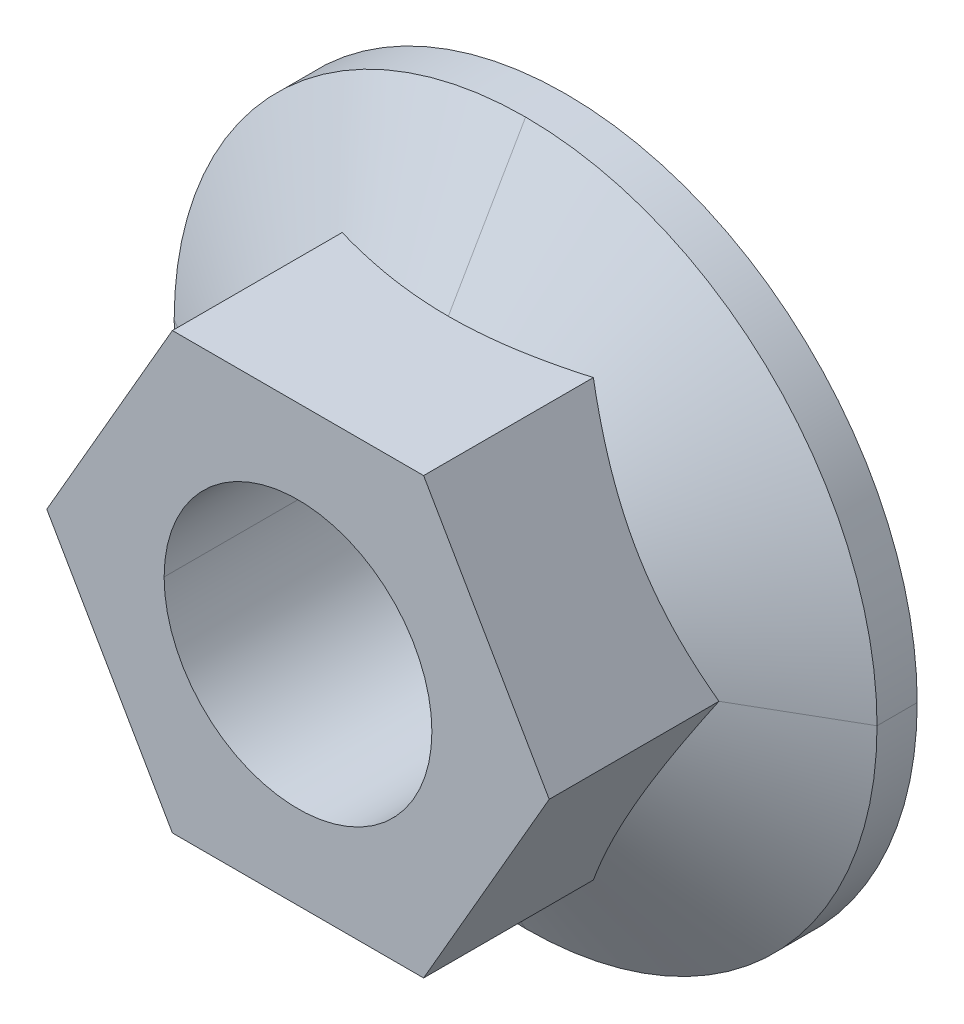
ISO-10303-21;
HEADER;
FILE_DESCRIPTION(('STEP AP214'),'2;1');
FILE_NAME('part.step','',(''),(''),'','','');
FILE_SCHEMA(('AUTOMOTIVE_DESIGN { 1 0 10303 214 1 1 1 1 }'));
ENDSEC;
DATA;
#1=APPLICATION_CONTEXT('core data for automotive mechanical design processes');
#2=APPLICATION_PROTOCOL_DEFINITION('international standard','automotive_design',2000,#1);
#3=PRODUCT_CONTEXT('',#1,'mechanical');
#4=PRODUCT('Part','Part','',(#3));
#5=PRODUCT_RELATED_PRODUCT_CATEGORY('part','',(#4));
#6=PRODUCT_DEFINITION_FORMATION('','',#4);
#7=PRODUCT_DEFINITION_CONTEXT('part definition',#1,'design');
#8=PRODUCT_DEFINITION('design','',#6,#7);
#9=PRODUCT_DEFINITION_SHAPE('','',#8);
#10=(LENGTH_UNIT() NAMED_UNIT(*) SI_UNIT(.MILLI.,.METRE.));
#11=(NAMED_UNIT(*) PLANE_ANGLE_UNIT() SI_UNIT($,.RADIAN.));
#12=(NAMED_UNIT(*) SI_UNIT($,.STERADIAN.) SOLID_ANGLE_UNIT());
#13=UNCERTAINTY_MEASURE_WITH_UNIT(LENGTH_MEASURE(1.E-05),#10,'distance_accuracy_value','');
#14=(GEOMETRIC_REPRESENTATION_CONTEXT(3) GLOBAL_UNCERTAINTY_ASSIGNED_CONTEXT((#13)) GLOBAL_UNIT_ASSIGNED_CONTEXT((#10,
#11,#12)) REPRESENTATION_CONTEXT('',''));
#15=CARTESIAN_POINT('',(0.,0.,0.));
#16=DIRECTION('',(0.,0.,1.));
#17=DIRECTION('',(1.,0.,0.));
#18=AXIS2_PLACEMENT_3D('',#15,#16,#17);
#19=CARTESIAN_POINT('',(-7.69319233695161,-0.325000000000484,8.2535577753421));
#20=DIRECTION('',(-0.866025403784461,0.499999999999961,0.));
#21=DIRECTION('',(0.,0.,1.));
#22=AXIS2_PLACEMENT_3D('',#19,#20,#21);
#23=PLANE('',#22);
#24=DIRECTION('',(0.,0.,-1.));
#25=VECTOR('',#24,1.);
#26=CARTESIAN_POINT('',(-3.75277674973342,6.49999999999976,8.));
#27=LINE('',#26,#25);
#28=CARTESIAN_POINT('',(-3.75277674973342,6.49999999999976,8.));
#29=VERTEX_POINT('',#28);
#30=CARTESIAN_POINT('',(-3.75277674973342,6.49999999999976,2.928844493158));
#31=VERTEX_POINT('',#30);
#32=EDGE_CURVE('E11',#29,#31,#27,.T.);
#33=ORIENTED_EDGE('',*,*,#32,.T.);
#34=CARTESIAN_POINT('',(-3.75277674973287,6.49999999999944,2.928844493158));
#35=CARTESIAN_POINT('',(-4.2551902713605,5.62979425413068,3.21891307511229));
#36=CARTESIAN_POINT('',(-4.70764700601063,4.84611620148987,3.3614471829164));
#37=CARTESIAN_POINT('',(-5.17712493961034,4.03295656746265,3.50934335347754));
#38=CARTESIAN_POINT('',(-5.62916551508448,3.24999932365868,3.5093859456862));
#39=CARTESIAN_POINT('',(-6.08068412274653,2.46794615462516,3.50942848871397));
#40=CARTESIAN_POINT('',(-6.55068458913403,1.65388146726086,3.36144678727725));
#41=CARTESIAN_POINT('',(-7.00284985851243,0.870708247279326,3.21908057558494));
#42=CARTESIAN_POINT('',(-7.505553499465,-4.86644145120119E-13,2.928844493158));
#43=B_SPLINE_CURVE_WITH_KNOTS('',2,(#34,#35,#36,#37,#38,#39,#40,#41,#42),.UNSPECIFIED.,.F.,.F.,
(3,2,2,2,3),(0.,0.25,0.5,0.75,1.),.UNSPECIFIED.);
#44=CARTESIAN_POINT('',(-7.505553499465,-4.88124996424892E-13,2.928844493158));
#45=VERTEX_POINT('',#44);
#46=EDGE_CURVE('E256',#31,#45,#43,.T.);
#47=ORIENTED_EDGE('',*,*,#46,.T.);
#48=DIRECTION('',(0.,0.,-1.));
#49=VECTOR('',#48,1.);
#50=CARTESIAN_POINT('',(-7.505553499465,-4.87814487950439E-13,8.));
#51=LINE('',#50,#49);
#52=CARTESIAN_POINT('',(-7.505553499465,-4.87814487950439E-13,8.));
#53=VERTEX_POINT('',#52);
#54=EDGE_CURVE('E269',#53,#45,#51,.T.);
#55=ORIENTED_EDGE('',*,*,#54,.F.);
#56=DIRECTION('',(0.499999999999887,0.866025403784504,0.));
#57=VECTOR('',#56,1.);
#58=CARTESIAN_POINT('',(-7.505553499465,-4.87814487950439E-13,8.));
#59=LINE('',#58,#57);
#60=EDGE_CURVE('E363',#53,#29,#59,.T.);
#61=ORIENTED_EDGE('',*,*,#60,.T.);
#62=EDGE_LOOP('',(#33,#47,#55,#61));
#63=FACE_BOUND('',#62,.T.);
#64=ADVANCED_FACE('F16',(#63),#23,.T.);
#65=CARTESIAN_POINT('',(-4.12805442470672,6.49999999999973,8.2535577753421));
#66=DIRECTION('',(0.,1.,0.));
#67=DIRECTION('',(1.,0.,0.));
#68=AXIS2_PLACEMENT_3D('',#65,#66,#67);
#69=PLANE('',#68);
#70=DIRECTION('',(0.,0.,-1.));
#71=VECTOR('',#70,1.);
#72=CARTESIAN_POINT('',(3.75277674973258,6.50000000000024,8.));
#73=LINE('',#72,#71);
#74=CARTESIAN_POINT('',(3.75277674973258,6.50000000000024,8.));
#75=VERTEX_POINT('',#74);
#76=CARTESIAN_POINT('',(3.75277674973258,6.50000000000024,2.928844493158));
#77=VERTEX_POINT('',#76);
#78=EDGE_CURVE('E28',#75,#77,#73,.T.);
#79=ORIENTED_EDGE('',*,*,#78,.T.);
#80=CARTESIAN_POINT('',(3.75277674973258,6.50000000000024,2.928844493158));
#81=CARTESIAN_POINT('',(2.74794927567332,6.50000000000018,3.21891319947502));
#82=CARTESIAN_POINT('',(1.84303567592422,6.50000000000012,3.36144726382099));
#83=CARTESIAN_POINT('',(0.903809546080359,6.50000000000006,3.50938593737357));
#84=CARTESIAN_POINT('',(-4.30211422042248E-13,6.5,3.50938593842317));
#85=B_SPLINE_CURVE_WITH_KNOTS('',2,(#80,#81,#82,#83,#84),.UNSPECIFIED.,.F.,.F.,(3,2,3),(0.,0.5,
1.),.UNSPECIFIED.);
#86=CARTESIAN_POINT('',(-4.13110422832091E-13,6.5,3.50940106915116));
#87=VERTEX_POINT('',#86);
#88=EDGE_CURVE('E365',#77,#87,#85,.T.);
#89=ORIENTED_EDGE('',*,*,#88,.T.);
#90=CARTESIAN_POINT('',(-4.30211422042248E-13,6.5,3.50938593842317));
#91=CARTESIAN_POINT('',(-0.903305607520865,6.49999999999994,3.50938593947218));
#92=CARTESIAN_POINT('',(-1.84303487596856,6.49999999999988,3.36144739456328));
#93=CARTESIAN_POINT('',(-2.74736684883038,6.49999999999982,3.21908133162181));
#94=CARTESIAN_POINT('',(-3.75277674973342,6.49999999999975,2.928844493158));
#95=B_SPLINE_CURVE_WITH_KNOTS('',2,(#90,#91,#92,#93,#94),.UNSPECIFIED.,.F.,.F.,(3,2,3),(0.,0.5,
1.),.UNSPECIFIED.);
#96=EDGE_CURVE('E273',#87,#31,#95,.T.);
#97=ORIENTED_EDGE('',*,*,#96,.T.);
#98=ORIENTED_EDGE('',*,*,#32,.F.);
#99=DIRECTION('',(1.,0.,0.));
#100=VECTOR('',#99,1.);
#101=CARTESIAN_POINT('',(-3.75277674973342,6.49999999999976,8.));
#102=LINE('',#101,#100);
#103=EDGE_CURVE('E601',#29,#75,#102,.T.);
#104=ORIENTED_EDGE('',*,*,#103,.T.);
#105=EDGE_LOOP('',(#79,#89,#97,#98,#104));
#106=FACE_BOUND('',#105,.T.);
#107=ADVANCED_FACE('F341',(#106),#69,.T.);
#108=CARTESIAN_POINT('',(3.56513791224593,6.82500000000022,8.2535577753421));
#109=DIRECTION('',(0.866025403784396,0.500000000000073,0.));
#110=DIRECTION('',(0.,0.,-1.));
#111=AXIS2_PLACEMENT_3D('',#108,#109,#110);
#112=PLANE('',#111);
#113=DIRECTION('',(0.,0.,-1.));
#114=VECTOR('',#113,1.);
#115=CARTESIAN_POINT('',(7.505553499465,4.88794173070438E-13,8.));
#116=LINE('',#115,#114);
#117=CARTESIAN_POINT('',(7.505553499465,4.88794173070438E-13,8.));
#118=VERTEX_POINT('',#117);
#119=CARTESIAN_POINT('',(7.505553499465,4.88483664595985E-13,2.928844493158));
#120=VERTEX_POINT('',#119);
#121=EDGE_CURVE('E292',#118,#120,#116,.T.);
#122=ORIENTED_EDGE('',*,*,#121,.T.);
#123=CARTESIAN_POINT('',(7.50555349946556,8.10115863281169E-13,2.928844493158));
#124=CARTESIAN_POINT('',(7.0031405312489,0.870204787333379,3.21891275560065));
#125=CARTESIAN_POINT('',(6.55068391641673,1.65388263244317,3.36144699833052));
#126=CARTESIAN_POINT('',(6.08120648335359,2.46704139951538,3.50934319037811));
#127=CARTESIAN_POINT('',(5.62916579924058,3.24999883148715,3.50938594638627));
#128=CARTESIAN_POINT('',(5.17764828074596,4.0320501140271,3.5094286529111));
#129=CARTESIAN_POINT('',(4.70764857465841,4.84611348451301,3.36144768267794));
#130=CARTESIAN_POINT('',(4.25548210837812,5.62928877758921,3.21908156729445));
#131=CARTESIAN_POINT('',(3.75277674973258,6.50000000000024,2.928844493158));
#132=B_SPLINE_CURVE_WITH_KNOTS('',2,(#123,#124,#125,#126,#127,#128,#129,#130,#131),
.UNSPECIFIED.,.F.,.F.,(3,2,2,2,3),(0.,0.25,0.5,0.75,1.),.UNSPECIFIED.);
#133=EDGE_CURVE('E325',#120,#77,#132,.T.);
#134=ORIENTED_EDGE('',*,*,#133,.T.);
#135=ORIENTED_EDGE('',*,*,#78,.F.);
#136=DIRECTION('',(0.5,-0.866025403784439,0.));
#137=VECTOR('',#136,1.);
#138=CARTESIAN_POINT('',(3.75277674973258,6.50000000000024,8.));
#139=LINE('',#138,#137);
#140=EDGE_CURVE('E578',#75,#118,#139,.T.);
#141=ORIENTED_EDGE('',*,*,#140,.T.);
#142=EDGE_LOOP('',(#122,#134,#135,#141));
#143=FACE_BOUND('',#142,.T.);
#144=ADVANCED_FACE('F332',(#143),#112,.T.);
#145=CARTESIAN_POINT('',(7.69319233695161,0.325000000000485,8.2535577753421));
#146=DIRECTION('',(0.866025403784461,-0.499999999999961,0.));
#147=DIRECTION('',(0.,0.,-1.));
#148=AXIS2_PLACEMENT_3D('',#145,#146,#147);
#149=PLANE('',#148);
#150=DIRECTION('',(0.,0.,-1.));
#151=VECTOR('',#150,1.);
#152=CARTESIAN_POINT('',(3.75277674973342,-6.49999999999976,8.));
#153=LINE('',#152,#151);
#154=CARTESIAN_POINT('',(3.75277674973342,-6.49999999999976,8.));
#155=VERTEX_POINT('',#154);
#156=CARTESIAN_POINT('',(3.75277674973342,-6.49999999999976,2.928844493158));
#157=VERTEX_POINT('',#156);
#158=EDGE_CURVE('E221',#155,#157,#153,.T.);
#159=ORIENTED_EDGE('',*,*,#158,.T.);
#160=CARTESIAN_POINT('',(3.75277674973287,-6.49999999999944,2.928844493158));
#161=CARTESIAN_POINT('',(4.25519027136226,-5.62979425412764,3.2189130751133));
#162=CARTESIAN_POINT('',(4.70764700601063,-4.84611620148986,3.3614471829164));
#163=CARTESIAN_POINT('',(5.17712493961186,-4.03295656746001,3.50934335347754));
#164=CARTESIAN_POINT('',(5.62916551508447,-3.24999932365868,3.5093859456862));
#165=CARTESIAN_POINT('',(6.08068412274653,-2.46794615462516,3.50942848871397));
#166=CARTESIAN_POINT('',(6.55068458913403,-1.65388146726086,3.36144678727725));
#167=CARTESIAN_POINT('',(7.00284985851243,-0.870708247279323,3.21908057558494));
#168=CARTESIAN_POINT('',(7.505553499465,4.87348876532234E-13,2.928844493158));
#169=B_SPLINE_CURVE_WITH_KNOTS('',2,(#160,#161,#162,#163,#164,#165,#166,#167,#168),
.UNSPECIFIED.,.F.,.F.,(3,2,2,2,3),(0.,0.25,0.5,0.75,1.),.UNSPECIFIED.);
#170=EDGE_CURVE('E371',#157,#120,#169,.T.);
#171=ORIENTED_EDGE('',*,*,#170,.T.);
#172=ORIENTED_EDGE('',*,*,#121,.F.);
#173=DIRECTION('',(-0.499999999999887,-0.866025403784504,0.));
#174=VECTOR('',#173,1.);
#175=CARTESIAN_POINT('',(7.505553499465,4.88794173070438E-13,8.));
#176=LINE('',#175,#174);
#177=EDGE_CURVE('E573',#118,#155,#176,.T.);
#178=ORIENTED_EDGE('',*,*,#177,.T.);
#179=EDGE_LOOP('',(#159,#171,#172,#178));
#180=FACE_BOUND('',#179,.T.);
#181=ADVANCED_FACE('F200',(#180),#149,.T.);
#182=CARTESIAN_POINT('',(4.12805442470672,-6.49999999999973,8.2535577753421));
#183=DIRECTION('',(0.,-1.,0.));
#184=DIRECTION('',(0.,0.,-1.));
#185=AXIS2_PLACEMENT_3D('',#182,#183,#184);
#186=PLANE('',#185);
#187=DIRECTION('',(0.,0.,-1.));
#188=VECTOR('',#187,1.);
#189=CARTESIAN_POINT('',(-3.75277674973258,-6.50000000000024,8.));
#190=LINE('',#189,#188);
#191=CARTESIAN_POINT('',(-3.75277674973258,-6.50000000000024,8.));
#192=VERTEX_POINT('',#191);
#193=CARTESIAN_POINT('',(-3.75277674973258,-6.50000000000024,2.928844493158));
#194=VERTEX_POINT('',#193);
#195=EDGE_CURVE('E41',#192,#194,#190,.T.);
#196=ORIENTED_EDGE('',*,*,#195,.T.);
#197=CARTESIAN_POINT('',(-3.75277674973258,-6.50000000000024,2.928844493158));
#198=CARTESIAN_POINT('',(-2.74794927567332,-6.50000000000018,3.21891319947502));
#199=CARTESIAN_POINT('',(-1.84303567592422,-6.50000000000012,3.36144726382099));
#200=CARTESIAN_POINT('',(-0.903809546080359,-6.50000000000006,3.50938593737357));
#201=CARTESIAN_POINT('',(4.30211422042248E-13,-6.5,3.50938593842317));
#202=B_SPLINE_CURVE_WITH_KNOTS('',2,(#197,#198,#199,#200,#201),.UNSPECIFIED.,.F.,.F.,(3,2,3),
(0.,0.5,1.),.UNSPECIFIED.);
#203=CARTESIAN_POINT('',(4.13110447465701E-13,-6.5,3.50940106915116));
#204=VERTEX_POINT('',#203);
#205=EDGE_CURVE('E183',#194,#204,#202,.T.);
#206=ORIENTED_EDGE('',*,*,#205,.T.);
#207=CARTESIAN_POINT('',(4.30211422042248E-13,-6.5,3.50938593842317));
#208=CARTESIAN_POINT('',(0.903305607520865,-6.49999999999994,3.50938593947218));
#209=CARTESIAN_POINT('',(1.84303487596856,-6.49999999999988,3.36144739456328));
#210=CARTESIAN_POINT('',(2.74736684883038,-6.49999999999982,3.21908133162181));
#211=CARTESIAN_POINT('',(3.75277674973342,-6.49999999999975,2.928844493158));
#212=B_SPLINE_CURVE_WITH_KNOTS('',2,(#207,#208,#209,#210,#211),.UNSPECIFIED.,.F.,.F.,(3,2,3),
(0.,0.5,1.),.UNSPECIFIED.);
#213=EDGE_CURVE('E170',#204,#157,#212,.T.);
#214=ORIENTED_EDGE('',*,*,#213,.T.);
#215=ORIENTED_EDGE('',*,*,#158,.F.);
#216=DIRECTION('',(-1.,0.,0.));
#217=VECTOR('',#216,1.);
#218=CARTESIAN_POINT('',(3.75277674973342,-6.49999999999976,8.));
#219=LINE('',#218,#217);
#220=EDGE_CURVE('E579',#155,#192,#219,.T.);
#221=ORIENTED_EDGE('',*,*,#220,.T.);
#222=EDGE_LOOP('',(#196,#206,#214,#215,#221));
#223=FACE_BOUND('',#222,.T.);
#224=ADVANCED_FACE('F189',(#223),#186,.T.);
#225=CARTESIAN_POINT('',(-3.56513791224593,-6.82500000000022,8.2535577753421));
#226=DIRECTION('',(-0.866025403784396,-0.500000000000073,0.));
#227=DIRECTION('',(-0.500000000000073,0.866025403784396,0.));
#228=AXIS2_PLACEMENT_3D('',#225,#226,#227);
#229=PLANE('',#228);
#230=ORIENTED_EDGE('',*,*,#54,.T.);
#231=CARTESIAN_POINT('',(-7.50555349946556,-8.10115863281169E-13,2.928844493158));
#232=CARTESIAN_POINT('',(-7.00314053124934,-0.870204787332608,3.21891275560039));
#233=CARTESIAN_POINT('',(-6.55068391641673,-1.65388263244317,3.36144699833052));
#234=CARTESIAN_POINT('',(-6.08120648335397,-2.46704139951472,3.50934319037811));
#235=CARTESIAN_POINT('',(-5.62916579924058,-3.24999883148715,3.50938594638627));
#236=CARTESIAN_POINT('',(-5.17764828074615,-4.03205011402678,3.5094286529111));
#237=CARTESIAN_POINT('',(-4.70764857465841,-4.84611348451302,3.36144768267793));
#238=CARTESIAN_POINT('',(-4.25548210837834,-5.62928877758883,3.21908156729458));
#239=CARTESIAN_POINT('',(-3.75277674973258,-6.50000000000024,2.928844493158));
#240=B_SPLINE_CURVE_WITH_KNOTS('',2,(#231,#232,#233,#234,#235,#236,#237,#238,#239),
.UNSPECIFIED.,.F.,.F.,(3,2,2,2,3),(0.,0.25,0.5,0.75,1.),.UNSPECIFIED.);
#241=EDGE_CURVE('E293',#45,#194,#240,.T.);
#242=ORIENTED_EDGE('',*,*,#241,.T.);
#243=ORIENTED_EDGE('',*,*,#195,.F.);
#244=DIRECTION('',(-0.5,0.866025403784439,0.));
#245=VECTOR('',#244,1.);
#246=CARTESIAN_POINT('',(-3.75277674973258,-6.50000000000024,8.));
#247=LINE('',#246,#245);
#248=EDGE_CURVE('E585',#192,#53,#247,.T.);
#249=ORIENTED_EDGE('',*,*,#248,.T.);
#250=EDGE_LOOP('',(#230,#242,#243,#249));
#251=FACE_BOUND('',#250,.T.);
#252=ADVANCED_FACE('F199',(#251),#229,.T.);
#253=CARTESIAN_POINT('',(0.,0.,6.26217782649082));
#254=DIRECTION('',(0.,0.,-1.));
#255=DIRECTION('',(0.,1.,0.));
#256=AXIS2_PLACEMENT_3D('',#253,#254,#255);
#257=CONICAL_SURFACE('',#256,1.73205080756888,1.04719755);
#258=DIRECTION('',(0.,0.86602540318614,0.500000001036284));
#259=VECTOR('',#258,1.);
#260=CARTESIAN_POINT('',(1.12473499685435E-13,-1.73205080756888,6.26217782649082));
#261=LINE('',#260,#259);
#262=CARTESIAN_POINT('',(6.81834355860895E-13,-10.5,1.2));
#263=VERTEX_POINT('',#262);
#264=EDGE_CURVE('E144',#263,#204,#261,.T.);
#265=ORIENTED_EDGE('',*,*,#264,.T.);
#266=ORIENTED_EDGE('',*,*,#205,.F.);
#267=ORIENTED_EDGE('',*,*,#241,.F.);
#268=DIRECTION('',(0.866025403784415,0.,0.50000000000004));
#269=VECTOR('',#268,1.);
#270=CARTESIAN_POINT('',(-10.5,-6.83046758616E-13,1.2));
#271=LINE('',#270,#269);
#272=CARTESIAN_POINT('',(-10.5,-6.83046758616E-13,1.2));
#273=VERTEX_POINT('',#272);
#274=EDGE_CURVE('E147',#273,#45,#271,.T.);
#275=ORIENTED_EDGE('',*,*,#274,.F.);
#276=CARTESIAN_POINT('',(0.,0.,1.2));
#277=DIRECTION('',(0.,0.,-1.));
#278=DIRECTION('',(1.,0.,0.));
#279=AXIS2_PLACEMENT_3D('',#276,#277,#278);
#280=CIRCLE('',#279,10.5);
#281=EDGE_CURVE('E139',#263,#273,#280,.T.);
#282=ORIENTED_EDGE('',*,*,#281,.F.);
#283=EDGE_LOOP('',(#265,#266,#267,#275,#282));
#284=FACE_BOUND('',#283,.T.);
#285=ADVANCED_FACE('F141',(#284),#257,.T.);
#286=CARTESIAN_POINT('',(0.,0.,6.26217782649082));
#287=DIRECTION('',(0.,0.,-1.));
#288=DIRECTION('',(0.,-1.,0.));
#289=AXIS2_PLACEMENT_3D('',#286,#287,#288);
#290=CONICAL_SURFACE('',#289,1.73205080756888,1.04719755);
#291=DIRECTION('',(0.,-0.86602540318614,0.500000001036285));
#292=VECTOR('',#291,1.);
#293=CARTESIAN_POINT('',(-1.12473499685435E-13,1.73205080756888,6.26217782649082));
#294=LINE('',#293,#292);
#295=CARTESIAN_POINT('',(-6.81834355860895E-13,10.5,1.2));
#296=VERTEX_POINT('',#295);
#297=EDGE_CURVE('E281',#296,#87,#294,.T.);
#298=ORIENTED_EDGE('',*,*,#297,.T.);
#299=ORIENTED_EDGE('',*,*,#88,.F.);
#300=ORIENTED_EDGE('',*,*,#133,.F.);
#301=DIRECTION('',(-0.866025403784415,0.,0.50000000000004));
#302=VECTOR('',#301,1.);
#303=CARTESIAN_POINT('',(10.5,6.83193711384E-13,1.2));
#304=LINE('',#303,#302);
#305=CARTESIAN_POINT('',(10.5,6.83193711384E-13,1.2));
#306=VERTEX_POINT('',#305);
#307=EDGE_CURVE('E164',#306,#120,#304,.T.);
#308=ORIENTED_EDGE('',*,*,#307,.F.);
#309=CARTESIAN_POINT('',(0.,0.,1.2));
#310=DIRECTION('',(0.,0.,1.));
#311=DIRECTION('',(1.,0.,0.));
#312=AXIS2_PLACEMENT_3D('',#309,#310,#311);
#313=CIRCLE('',#312,10.5);
#314=EDGE_CURVE('E366',#306,#296,#313,.T.);
#315=ORIENTED_EDGE('',*,*,#314,.T.);
#316=EDGE_LOOP('',(#298,#299,#300,#308,#315));
#317=FACE_BOUND('',#316,.T.);
#318=ADVANCED_FACE('F203',(#317),#290,.T.);
#319=CARTESIAN_POINT('',(0.,0.,8.4));
#320=DIRECTION('',(0.,0.,1.));
#321=DIRECTION('',(-1.,0.,0.));
#322=AXIS2_PLACEMENT_3D('',#319,#320,#321);
#323=CYLINDRICAL_SURFACE('',#322,10.5);
#324=CARTESIAN_POINT('',(0.,0.,0.));
#325=DIRECTION('',(0.,0.,1.));
#326=DIRECTION('',(1.,0.,0.));
#327=AXIS2_PLACEMENT_3D('',#324,#325,#326);
#328=CIRCLE('',#327,10.5);
#329=CARTESIAN_POINT('',(10.5,6.83120235E-13,0.));
#330=VERTEX_POINT('',#329);
#331=CARTESIAN_POINT('',(-10.5,-6.83120235E-13,0.));
#332=VERTEX_POINT('',#331);
#333=EDGE_CURVE('E539',#330,#332,#328,.T.);
#334=ORIENTED_EDGE('',*,*,#333,.T.);
#335=DIRECTION('',(0.,0.,1.));
#336=VECTOR('',#335,1.);
#337=CARTESIAN_POINT('',(-10.5,-6.83120235E-13,0.));
#338=LINE('',#337,#336);
#339=EDGE_CURVE('E151',#332,#273,#338,.T.);
#340=ORIENTED_EDGE('',*,*,#339,.T.);
#341=CARTESIAN_POINT('',(0.,0.,1.2));
#342=DIRECTION('',(0.,0.,1.));
#343=DIRECTION('',(1.,0.,0.));
#344=AXIS2_PLACEMENT_3D('',#341,#342,#343);
#345=CIRCLE('',#344,10.5);
#346=EDGE_CURVE('E276',#296,#273,#345,.T.);
#347=ORIENTED_EDGE('',*,*,#346,.F.);
#348=ORIENTED_EDGE('',*,*,#314,.F.);
#349=DIRECTION('',(0.,0.,1.));
#350=VECTOR('',#349,1.);
#351=CARTESIAN_POINT('',(10.5,6.83120235E-13,0.));
#352=LINE('',#351,#350);
#353=EDGE_CURVE('E159',#330,#306,#352,.T.);
#354=ORIENTED_EDGE('',*,*,#353,.F.);
#355=EDGE_LOOP('',(#334,#340,#347,#348,#354));
#356=FACE_BOUND('',#355,.T.);
#357=ADVANCED_FACE('F201',(#356),#323,.T.);
#358=CARTESIAN_POINT('',(0.,0.,8.4));
#359=DIRECTION('',(0.,0.,1.));
#360=DIRECTION('',(-1.,0.,0.));
#361=AXIS2_PLACEMENT_3D('',#358,#359,#360);
#362=CYLINDRICAL_SURFACE('',#361,10.5);
#363=CARTESIAN_POINT('',(0.,0.,1.2));
#364=DIRECTION('',(0.,0.,-1.));
#365=DIRECTION('',(1.,0.,0.));
#366=AXIS2_PLACEMENT_3D('',#363,#364,#365);
#367=CIRCLE('',#366,10.5);
#368=EDGE_CURVE('E156',#306,#263,#367,.T.);
#369=ORIENTED_EDGE('',*,*,#368,.T.);
#370=ORIENTED_EDGE('',*,*,#281,.T.);
#371=ORIENTED_EDGE('',*,*,#339,.F.);
#372=CARTESIAN_POINT('',(0.,0.,0.));
#373=DIRECTION('',(0.,0.,-1.));
#374=DIRECTION('',(1.,0.,0.));
#375=AXIS2_PLACEMENT_3D('',#372,#373,#374);
#376=CIRCLE('',#375,10.5);
#377=EDGE_CURVE('E152',#330,#332,#376,.T.);
#378=ORIENTED_EDGE('',*,*,#377,.F.);
#379=ORIENTED_EDGE('',*,*,#353,.T.);
#380=EDGE_LOOP('',(#369,#370,#371,#378,#379));
#381=FACE_BOUND('',#380,.T.);
#382=ADVANCED_FACE('F157',(#381),#362,.T.);
#383=CARTESIAN_POINT('',(11.5500000000008,-11.5499999999992,0.));
#384=DIRECTION('',(0.,0.,-1.));
#385=DIRECTION('',(0.,-1.,0.));
#386=AXIS2_PLACEMENT_3D('',#383,#384,#385);
#387=PLANE('',#386);
#388=CARTESIAN_POINT('',(0.,0.,0.));
#389=DIRECTION('',(0.,0.,-1.));
#390=DIRECTION('',(1.,0.,0.));
#391=AXIS2_PLACEMENT_3D('',#388,#389,#390);
#392=CIRCLE('',#391,4.);
#393=CARTESIAN_POINT('',(4.,2.6023628E-13,0.));
#394=VERTEX_POINT('',#393);
#395=CARTESIAN_POINT('',(-4.,-2.6023628E-13,0.));
#396=VERTEX_POINT('',#395);
#397=EDGE_CURVE('E562',#394,#396,#392,.T.);
#398=ORIENTED_EDGE('',*,*,#397,.F.);
#399=CARTESIAN_POINT('',(0.,0.,0.));
#400=DIRECTION('',(0.,0.,1.));
#401=DIRECTION('',(1.,0.,0.));
#402=AXIS2_PLACEMENT_3D('',#399,#400,#401);
#403=CIRCLE('',#402,4.);
#404=EDGE_CURVE('E545',#394,#396,#403,.T.);
#405=ORIENTED_EDGE('',*,*,#404,.T.);
#406=EDGE_LOOP('',(#398,#405));
#407=FACE_BOUND('',#406,.T.);
#408=ORIENTED_EDGE('',*,*,#333,.F.);
#409=ORIENTED_EDGE('',*,*,#377,.T.);
#410=EDGE_LOOP('',(#408,#409));
#411=FACE_BOUND('',#410,.T.);
#412=ADVANCED_FACE('F464',(#407,#411),#387,.T.);
#413=CARTESIAN_POINT('',(0.,0.,8.4));
#414=DIRECTION('',(0.,0.,1.));
#415=DIRECTION('',(-1.,0.,0.));
#416=AXIS2_PLACEMENT_3D('',#413,#414,#415);
#417=CYLINDRICAL_SURFACE('',#416,4.);
#418=CARTESIAN_POINT('',(0.,0.,8.));
#419=DIRECTION('',(0.,0.,1.));
#420=DIRECTION('',(1.,0.,0.));
#421=AXIS2_PLACEMENT_3D('',#418,#419,#420);
#422=CIRCLE('',#421,4.);
#423=CARTESIAN_POINT('',(4.,2.6072612256E-13,8.));
#424=VERTEX_POINT('',#423);
#425=CARTESIAN_POINT('',(-4.,-2.5974643744E-13,8.));
#426=VERTEX_POINT('',#425);
#427=EDGE_CURVE('E570',#424,#426,#422,.T.);
#428=ORIENTED_EDGE('',*,*,#427,.T.);
#429=DIRECTION('',(0.,0.,-1.));
#430=VECTOR('',#429,1.);
#431=CARTESIAN_POINT('',(-4.,-2.5974643744E-13,8.));
#432=LINE('',#431,#430);
#433=EDGE_CURVE('E556',#426,#396,#432,.T.);
#434=ORIENTED_EDGE('',*,*,#433,.T.);
#435=ORIENTED_EDGE('',*,*,#404,.F.);
#436=DIRECTION('',(0.,0.,-1.));
#437=VECTOR('',#436,1.);
#438=CARTESIAN_POINT('',(4.,2.6072612256E-13,8.));
#439=LINE('',#438,#437);
#440=EDGE_CURVE('E550',#424,#394,#439,.T.);
#441=ORIENTED_EDGE('',*,*,#440,.F.);
#442=EDGE_LOOP('',(#428,#434,#435,#441));
#443=FACE_BOUND('',#442,.T.);
#444=ADVANCED_FACE('F311',(#443),#417,.F.);
#445=CARTESIAN_POINT('',(0.,0.,8.4));
#446=DIRECTION('',(0.,0.,1.));
#447=DIRECTION('',(-1.,0.,0.));
#448=AXIS2_PLACEMENT_3D('',#445,#446,#447);
#449=CYLINDRICAL_SURFACE('',#448,4.);
#450=ORIENTED_EDGE('',*,*,#397,.T.);
#451=ORIENTED_EDGE('',*,*,#433,.F.);
#452=CARTESIAN_POINT('',(0.,0.,8.));
#453=DIRECTION('',(0.,0.,-1.));
#454=DIRECTION('',(1.,0.,0.));
#455=AXIS2_PLACEMENT_3D('',#452,#453,#454);
#456=CIRCLE('',#455,4.);
#457=EDGE_CURVE('E565',#424,#426,#456,.T.);
#458=ORIENTED_EDGE('',*,*,#457,.F.);
#459=ORIENTED_EDGE('',*,*,#440,.T.);
#460=EDGE_LOOP('',(#450,#451,#458,#459));
#461=FACE_BOUND('',#460,.T.);
#462=ADVANCED_FACE('F480',(#461),#449,.F.);
#463=CARTESIAN_POINT('',(8.25610884941257,-7.14999999999946,8.));
#464=DIRECTION('',(0.,0.,-1.));
#465=DIRECTION('',(0.,-1.,0.));
#466=AXIS2_PLACEMENT_3D('',#463,#464,#465);
#467=PLANE('',#466);
#468=ORIENTED_EDGE('',*,*,#427,.F.);
#469=ORIENTED_EDGE('',*,*,#457,.T.);
#470=EDGE_LOOP('',(#468,#469));
#471=FACE_BOUND('',#470,.T.);
#472=ORIENTED_EDGE('',*,*,#60,.F.);
#473=ORIENTED_EDGE('',*,*,#248,.F.);
#474=ORIENTED_EDGE('',*,*,#220,.F.);
#475=ORIENTED_EDGE('',*,*,#177,.F.);
#476=ORIENTED_EDGE('',*,*,#140,.F.);
#477=ORIENTED_EDGE('',*,*,#103,.F.);
#478=EDGE_LOOP('',(#472,#473,#474,#475,#476,#477));
#479=FACE_BOUND('',#478,.T.);
#480=ADVANCED_FACE('F236',(#471,#479),#467,.F.);
#481=CARTESIAN_POINT('',(0.,0.,6.26217782649082));
#482=DIRECTION('',(0.,0.,-1.));
#483=DIRECTION('',(0.,-1.,0.));
#484=AXIS2_PLACEMENT_3D('',#481,#482,#483);
#485=CONICAL_SURFACE('',#484,1.73205080756888,1.04719755);
#486=ORIENTED_EDGE('',*,*,#297,.F.);
#487=ORIENTED_EDGE('',*,*,#346,.T.);
#488=ORIENTED_EDGE('',*,*,#274,.T.);
#489=ORIENTED_EDGE('',*,*,#46,.F.);
#490=ORIENTED_EDGE('',*,*,#96,.F.);
#491=EDGE_LOOP('',(#486,#487,#488,#489,#490));
#492=FACE_BOUND('',#491,.T.);
#493=ADVANCED_FACE('F231',(#492),#485,.T.);
#494=CARTESIAN_POINT('',(0.,0.,6.26217782649082));
#495=DIRECTION('',(0.,0.,-1.));
#496=DIRECTION('',(0.,1.,0.));
#497=AXIS2_PLACEMENT_3D('',#494,#495,#496);
#498=CONICAL_SURFACE('',#497,1.73205080756888,1.04719755);
#499=ORIENTED_EDGE('',*,*,#264,.F.);
#500=ORIENTED_EDGE('',*,*,#368,.F.);
#501=ORIENTED_EDGE('',*,*,#307,.T.);
#502=ORIENTED_EDGE('',*,*,#170,.F.);
#503=ORIENTED_EDGE('',*,*,#213,.F.);
#504=EDGE_LOOP('',(#499,#500,#501,#502,#503));
#505=FACE_BOUND('',#504,.T.);
#506=ADVANCED_FACE('F167',(#505),#498,.T.);
#507=CLOSED_SHELL('',(#64,#107,#144,#181,#224,#252,#285,#318,#357,#382,#412,#444,#462,#480,#493,#506));
#508=MANIFOLD_SOLID_BREP('B1',#507);
#509=ADVANCED_BREP_SHAPE_REPRESENTATION('',(#18,#508),#14);
#510=SHAPE_DEFINITION_REPRESENTATION(#9,#509);
ENDSEC;
END-ISO-10303-21;
